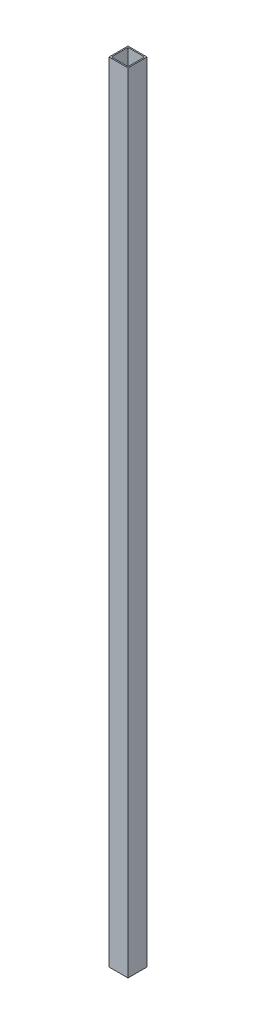
ISO-10303-21;
HEADER;
FILE_DESCRIPTION(('STEP AP214'),'2;1');
FILE_NAME('part.step','',(''),(''),'','','');
FILE_SCHEMA(('AUTOMOTIVE_DESIGN { 1 0 10303 214 1 1 1 1 }'));
ENDSEC;
DATA;
#1=APPLICATION_CONTEXT('core data for automotive mechanical design processes');
#2=APPLICATION_PROTOCOL_DEFINITION('international standard','automotive_design',2000,#1);
#3=PRODUCT_CONTEXT('',#1,'mechanical');
#4=PRODUCT('Part','Part','',(#3));
#5=PRODUCT_RELATED_PRODUCT_CATEGORY('part','',(#4));
#6=PRODUCT_DEFINITION_FORMATION('','',#4);
#7=PRODUCT_DEFINITION_CONTEXT('part definition',#1,'design');
#8=PRODUCT_DEFINITION('design','',#6,#7);
#9=PRODUCT_DEFINITION_SHAPE('','',#8);
#10=(LENGTH_UNIT() NAMED_UNIT(*) SI_UNIT(.MILLI.,.METRE.));
#11=(NAMED_UNIT(*) PLANE_ANGLE_UNIT() SI_UNIT($,.RADIAN.));
#12=(NAMED_UNIT(*) SI_UNIT($,.STERADIAN.) SOLID_ANGLE_UNIT());
#13=UNCERTAINTY_MEASURE_WITH_UNIT(LENGTH_MEASURE(1.E-05),#10,'distance_accuracy_value','');
#14=(GEOMETRIC_REPRESENTATION_CONTEXT(3) GLOBAL_UNCERTAINTY_ASSIGNED_CONTEXT((#13)) GLOBAL_UNIT_ASSIGNED_CONTEXT((#10,
#11,#12)) REPRESENTATION_CONTEXT('',''));
#15=CARTESIAN_POINT('',(0.,0.,0.));
#16=DIRECTION('',(0.,0.,1.));
#17=DIRECTION('',(1.,0.,0.));
#18=AXIS2_PLACEMENT_3D('',#15,#16,#17);
#19=CARTESIAN_POINT('',(0.,1054.1,0.));
#20=DIRECTION('',(0.,-1.,0.));
#21=DIRECTION('',(0.,0.,-1.));
#22=AXIS2_PLACEMENT_3D('',#19,#20,#21);
#23=PLANE('',#22);
#24=DIRECTION('',(0.,0.,1.));
#25=VECTOR('',#24,1.);
#26=CARTESIAN_POINT('',(-12.7,1054.1,-12.7));
#27=LINE('',#26,#25);
#28=CARTESIAN_POINT('',(-12.7,1054.1,-12.7));
#29=VERTEX_POINT('',#28);
#30=CARTESIAN_POINT('',(-12.7,1054.1,12.7));
#31=VERTEX_POINT('',#30);
#32=EDGE_CURVE('E136',#29,#31,#27,.T.);
#33=ORIENTED_EDGE('',*,*,#32,.T.);
#34=DIRECTION('',(1.,0.,0.));
#35=VECTOR('',#34,1.);
#36=CARTESIAN_POINT('',(12.7,1054.1,12.7));
#37=LINE('',#36,#35);
#38=CARTESIAN_POINT('',(12.7,1054.1,12.7));
#39=VERTEX_POINT('',#38);
#40=EDGE_CURVE('E139',#31,#39,#37,.T.);
#41=ORIENTED_EDGE('',*,*,#40,.T.);
#42=DIRECTION('',(0.,0.,-1.));
#43=VECTOR('',#42,1.);
#44=CARTESIAN_POINT('',(12.7,1054.1,-12.7));
#45=LINE('',#44,#43);
#46=CARTESIAN_POINT('',(12.7,1054.1,-12.7));
#47=VERTEX_POINT('',#46);
#48=EDGE_CURVE('E142',#39,#47,#45,.T.);
#49=ORIENTED_EDGE('',*,*,#48,.T.);
#50=DIRECTION('',(-1.,0.,0.));
#51=VECTOR('',#50,1.);
#52=CARTESIAN_POINT('',(12.7,1054.1,-12.7));
#53=LINE('',#52,#51);
#54=EDGE_CURVE('E144',#47,#29,#53,.T.);
#55=ORIENTED_EDGE('',*,*,#54,.T.);
#56=EDGE_LOOP('',(#33,#41,#49,#55));
#57=FACE_BOUND('',#56,.T.);
#58=DIRECTION('',(0.,0.,1.));
#59=VECTOR('',#58,1.);
#60=CARTESIAN_POINT('',(-11.1125,1054.1,-11.1125));
#61=LINE('',#60,#59);
#62=CARTESIAN_POINT('',(-11.1125,1054.1,-11.1125));
#63=VERTEX_POINT('',#62);
#64=CARTESIAN_POINT('',(-11.1125,1054.1,11.1125));
#65=VERTEX_POINT('',#64);
#66=EDGE_CURVE('E100',#63,#65,#61,.T.);
#67=ORIENTED_EDGE('',*,*,#66,.F.);
#68=DIRECTION('',(-1.,0.,0.));
#69=VECTOR('',#68,1.);
#70=CARTESIAN_POINT('',(11.1125,1054.1,-11.1125));
#71=LINE('',#70,#69);
#72=CARTESIAN_POINT('',(11.1125,1054.1,-11.1125));
#73=VERTEX_POINT('',#72);
#74=EDGE_CURVE('E122',#73,#63,#71,.T.);
#75=ORIENTED_EDGE('',*,*,#74,.F.);
#76=DIRECTION('',(0.,0.,-1.));
#77=VECTOR('',#76,1.);
#78=CARTESIAN_POINT('',(11.1125,1054.1,-11.1125));
#79=LINE('',#78,#77);
#80=CARTESIAN_POINT('',(11.1125,1054.1,11.1125));
#81=VERTEX_POINT('',#80);
#82=EDGE_CURVE('E120',#81,#73,#79,.T.);
#83=ORIENTED_EDGE('',*,*,#82,.F.);
#84=DIRECTION('',(1.,0.,0.));
#85=VECTOR('',#84,1.);
#86=CARTESIAN_POINT('',(11.1125,1054.1,11.1125));
#87=LINE('',#86,#85);
#88=EDGE_CURVE('E108',#65,#81,#87,.T.);
#89=ORIENTED_EDGE('',*,*,#88,.F.);
#90=EDGE_LOOP('',(#67,#75,#83,#89));
#91=FACE_BOUND('',#90,.T.);
#92=ADVANCED_FACE('F35',(#57,#91),#23,.F.);
#93=CARTESIAN_POINT('',(0.,0.,0.));
#94=DIRECTION('',(0.,-1.,0.));
#95=DIRECTION('',(0.,0.,-1.));
#96=AXIS2_PLACEMENT_3D('',#93,#94,#95);
#97=PLANE('',#96);
#98=DIRECTION('',(0.,0.,1.));
#99=VECTOR('',#98,1.);
#100=CARTESIAN_POINT('',(-12.7,0.,-12.7));
#101=LINE('',#100,#99);
#102=CARTESIAN_POINT('',(-12.7,0.,-12.7));
#103=VERTEX_POINT('',#102);
#104=CARTESIAN_POINT('',(-12.7,0.,12.7));
#105=VERTEX_POINT('',#104);
#106=EDGE_CURVE('E116',#103,#105,#101,.T.);
#107=ORIENTED_EDGE('',*,*,#106,.F.);
#108=DIRECTION('',(-1.,0.,0.));
#109=VECTOR('',#108,1.);
#110=CARTESIAN_POINT('',(12.7,0.,-12.7));
#111=LINE('',#110,#109);
#112=CARTESIAN_POINT('',(12.7,0.,-12.7));
#113=VERTEX_POINT('',#112);
#114=EDGE_CURVE('E140',#113,#103,#111,.T.);
#115=ORIENTED_EDGE('',*,*,#114,.F.);
#116=DIRECTION('',(0.,0.,-1.));
#117=VECTOR('',#116,1.);
#118=CARTESIAN_POINT('',(12.7,0.,-12.7));
#119=LINE('',#118,#117);
#120=CARTESIAN_POINT('',(12.7,0.,12.7));
#121=VERTEX_POINT('',#120);
#122=EDGE_CURVE('E151',#121,#113,#119,.T.);
#123=ORIENTED_EDGE('',*,*,#122,.F.);
#124=DIRECTION('',(1.,0.,0.));
#125=VECTOR('',#124,1.);
#126=CARTESIAN_POINT('',(12.7,0.,12.7));
#127=LINE('',#126,#125);
#128=EDGE_CURVE('E149',#105,#121,#127,.T.);
#129=ORIENTED_EDGE('',*,*,#128,.F.);
#130=EDGE_LOOP('',(#107,#115,#123,#129));
#131=FACE_BOUND('',#130,.T.);
#132=DIRECTION('',(-1.,0.,0.));
#133=VECTOR('',#132,1.);
#134=CARTESIAN_POINT('',(11.1125,0.,-11.1125));
#135=LINE('',#134,#133);
#136=CARTESIAN_POINT('',(11.1125,0.,-11.1125));
#137=VERTEX_POINT('',#136);
#138=CARTESIAN_POINT('',(-11.1125,0.,-11.1125));
#139=VERTEX_POINT('',#138);
#140=EDGE_CURVE('E109',#137,#139,#135,.T.);
#141=ORIENTED_EDGE('',*,*,#140,.T.);
#142=DIRECTION('',(0.,0.,1.));
#143=VECTOR('',#142,1.);
#144=CARTESIAN_POINT('',(-11.1125,0.,-11.1125));
#145=LINE('',#144,#143);
#146=CARTESIAN_POINT('',(-11.1125,0.,11.1125));
#147=VERTEX_POINT('',#146);
#148=EDGE_CURVE('E58',#139,#147,#145,.T.);
#149=ORIENTED_EDGE('',*,*,#148,.T.);
#150=DIRECTION('',(1.,0.,0.));
#151=VECTOR('',#150,1.);
#152=CARTESIAN_POINT('',(11.1125,0.,11.1125));
#153=LINE('',#152,#151);
#154=CARTESIAN_POINT('',(11.1125,0.,11.1125));
#155=VERTEX_POINT('',#154);
#156=EDGE_CURVE('E115',#147,#155,#153,.T.);
#157=ORIENTED_EDGE('',*,*,#156,.T.);
#158=DIRECTION('',(0.,0.,-1.));
#159=VECTOR('',#158,1.);
#160=CARTESIAN_POINT('',(11.1125,0.,-11.1125));
#161=LINE('',#160,#159);
#162=EDGE_CURVE('E128',#155,#137,#161,.T.);
#163=ORIENTED_EDGE('',*,*,#162,.T.);
#164=EDGE_LOOP('',(#141,#149,#157,#163));
#165=FACE_BOUND('',#164,.T.);
#166=ADVANCED_FACE('F169',(#131,#165),#97,.T.);
#167=CARTESIAN_POINT('',(-12.7,1054.1,-12.7));
#168=DIRECTION('',(1.,0.,0.));
#169=DIRECTION('',(0.,0.,-1.));
#170=AXIS2_PLACEMENT_3D('',#167,#168,#169);
#171=PLANE('',#170);
#172=ORIENTED_EDGE('',*,*,#106,.T.);
#173=DIRECTION('',(0.,-1.,0.));
#174=VECTOR('',#173,1.);
#175=CARTESIAN_POINT('',(-12.7,1054.1,12.7));
#176=LINE('',#175,#174);
#177=EDGE_CURVE('E11',#31,#105,#176,.T.);
#178=ORIENTED_EDGE('',*,*,#177,.F.);
#179=ORIENTED_EDGE('',*,*,#32,.F.);
#180=DIRECTION('',(0.,-1.,0.));
#181=VECTOR('',#180,1.);
#182=CARTESIAN_POINT('',(-12.7,1054.1,-12.7));
#183=LINE('',#182,#181);
#184=EDGE_CURVE('E146',#29,#103,#183,.T.);
#185=ORIENTED_EDGE('',*,*,#184,.T.);
#186=EDGE_LOOP('',(#172,#178,#179,#185));
#187=FACE_BOUND('',#186,.T.);
#188=ADVANCED_FACE('F37',(#187),#171,.F.);
#189=CARTESIAN_POINT('',(12.7,1054.1,12.7));
#190=DIRECTION('',(0.,0.,-1.));
#191=DIRECTION('',(-1.,0.,0.));
#192=AXIS2_PLACEMENT_3D('',#189,#190,#191);
#193=PLANE('',#192);
#194=ORIENTED_EDGE('',*,*,#128,.T.);
#195=DIRECTION('',(0.,-1.,0.));
#196=VECTOR('',#195,1.);
#197=CARTESIAN_POINT('',(12.7,1054.1,12.7));
#198=LINE('',#197,#196);
#199=EDGE_CURVE('E43',#39,#121,#198,.T.);
#200=ORIENTED_EDGE('',*,*,#199,.F.);
#201=ORIENTED_EDGE('',*,*,#40,.F.);
#202=ORIENTED_EDGE('',*,*,#177,.T.);
#203=EDGE_LOOP('',(#194,#200,#201,#202));
#204=FACE_BOUND('',#203,.T.);
#205=ADVANCED_FACE('F179',(#204),#193,.F.);
#206=CARTESIAN_POINT('',(12.7,1054.1,-12.7));
#207=DIRECTION('',(-1.,0.,0.));
#208=DIRECTION('',(0.,0.,1.));
#209=AXIS2_PLACEMENT_3D('',#206,#207,#208);
#210=PLANE('',#209);
#211=ORIENTED_EDGE('',*,*,#122,.T.);
#212=DIRECTION('',(0.,-1.,0.));
#213=VECTOR('',#212,1.);
#214=CARTESIAN_POINT('',(12.7,1054.1,-12.7));
#215=LINE('',#214,#213);
#216=EDGE_CURVE('E156',#47,#113,#215,.T.);
#217=ORIENTED_EDGE('',*,*,#216,.F.);
#218=ORIENTED_EDGE('',*,*,#48,.F.);
#219=ORIENTED_EDGE('',*,*,#199,.T.);
#220=EDGE_LOOP('',(#211,#217,#218,#219));
#221=FACE_BOUND('',#220,.T.);
#222=ADVANCED_FACE('F163',(#221),#210,.F.);
#223=CARTESIAN_POINT('',(12.7,1054.1,-12.7));
#224=DIRECTION('',(0.,0.,1.));
#225=DIRECTION('',(1.,0.,0.));
#226=AXIS2_PLACEMENT_3D('',#223,#224,#225);
#227=PLANE('',#226);
#228=ORIENTED_EDGE('',*,*,#114,.T.);
#229=ORIENTED_EDGE('',*,*,#184,.F.);
#230=ORIENTED_EDGE('',*,*,#54,.F.);
#231=ORIENTED_EDGE('',*,*,#216,.T.);
#232=EDGE_LOOP('',(#228,#229,#230,#231));
#233=FACE_BOUND('',#232,.T.);
#234=ADVANCED_FACE('F173',(#233),#227,.F.);
#235=CARTESIAN_POINT('',(-11.1125,1054.1,-11.1125));
#236=DIRECTION('',(1.,0.,0.));
#237=DIRECTION('',(0.,0.,-1.));
#238=AXIS2_PLACEMENT_3D('',#235,#236,#237);
#239=PLANE('',#238);
#240=ORIENTED_EDGE('',*,*,#148,.F.);
#241=DIRECTION('',(0.,-1.,0.));
#242=VECTOR('',#241,1.);
#243=CARTESIAN_POINT('',(-11.1125,1054.1,-11.1125));
#244=LINE('',#243,#242);
#245=EDGE_CURVE('E104',#63,#139,#244,.T.);
#246=ORIENTED_EDGE('',*,*,#245,.F.);
#247=ORIENTED_EDGE('',*,*,#66,.T.);
#248=DIRECTION('',(0.,-1.,0.));
#249=VECTOR('',#248,1.);
#250=CARTESIAN_POINT('',(-11.1125,1054.1,11.1125));
#251=LINE('',#250,#249);
#252=EDGE_CURVE('E103',#65,#147,#251,.T.);
#253=ORIENTED_EDGE('',*,*,#252,.T.);
#254=EDGE_LOOP('',(#240,#246,#247,#253));
#255=FACE_BOUND('',#254,.T.);
#256=ADVANCED_FACE('F102',(#255),#239,.T.);
#257=CARTESIAN_POINT('',(11.1125,1054.1,11.1125));
#258=DIRECTION('',(0.,0.,-1.));
#259=DIRECTION('',(-1.,0.,0.));
#260=AXIS2_PLACEMENT_3D('',#257,#258,#259);
#261=PLANE('',#260);
#262=ORIENTED_EDGE('',*,*,#156,.F.);
#263=ORIENTED_EDGE('',*,*,#252,.F.);
#264=ORIENTED_EDGE('',*,*,#88,.T.);
#265=DIRECTION('',(0.,-1.,0.));
#266=VECTOR('',#265,1.);
#267=CARTESIAN_POINT('',(11.1125,1054.1,11.1125));
#268=LINE('',#267,#266);
#269=EDGE_CURVE('E117',#81,#155,#268,.T.);
#270=ORIENTED_EDGE('',*,*,#269,.T.);
#271=EDGE_LOOP('',(#262,#263,#264,#270));
#272=FACE_BOUND('',#271,.T.);
#273=ADVANCED_FACE('F112',(#272),#261,.T.);
#274=CARTESIAN_POINT('',(11.1125,1054.1,-11.1125));
#275=DIRECTION('',(-1.,0.,0.));
#276=DIRECTION('',(0.,0.,1.));
#277=AXIS2_PLACEMENT_3D('',#274,#275,#276);
#278=PLANE('',#277);
#279=ORIENTED_EDGE('',*,*,#162,.F.);
#280=ORIENTED_EDGE('',*,*,#269,.F.);
#281=ORIENTED_EDGE('',*,*,#82,.T.);
#282=DIRECTION('',(0.,-1.,0.));
#283=VECTOR('',#282,1.);
#284=CARTESIAN_POINT('',(11.1125,1054.1,-11.1125));
#285=LINE('',#284,#283);
#286=EDGE_CURVE('E50',#73,#137,#285,.T.);
#287=ORIENTED_EDGE('',*,*,#286,.T.);
#288=EDGE_LOOP('',(#279,#280,#281,#287));
#289=FACE_BOUND('',#288,.T.);
#290=ADVANCED_FACE('F202',(#289),#278,.T.);
#291=CARTESIAN_POINT('',(11.1125,1054.1,-11.1125));
#292=DIRECTION('',(0.,0.,1.));
#293=DIRECTION('',(1.,0.,0.));
#294=AXIS2_PLACEMENT_3D('',#291,#292,#293);
#295=PLANE('',#294);
#296=ORIENTED_EDGE('',*,*,#140,.F.);
#297=ORIENTED_EDGE('',*,*,#286,.F.);
#298=ORIENTED_EDGE('',*,*,#74,.T.);
#299=ORIENTED_EDGE('',*,*,#245,.T.);
#300=EDGE_LOOP('',(#296,#297,#298,#299));
#301=FACE_BOUND('',#300,.T.);
#302=ADVANCED_FACE('F206',(#301),#295,.T.);
#303=CLOSED_SHELL('',(#92,#166,#188,#205,#222,#234,#256,#273,#290,#302));
#304=MANIFOLD_SOLID_BREP('B2',#303);
#305=ADVANCED_BREP_SHAPE_REPRESENTATION('',(#18,#304),#14);
#306=SHAPE_DEFINITION_REPRESENTATION(#9,#305);
ENDSEC;
END-ISO-10303-21;
